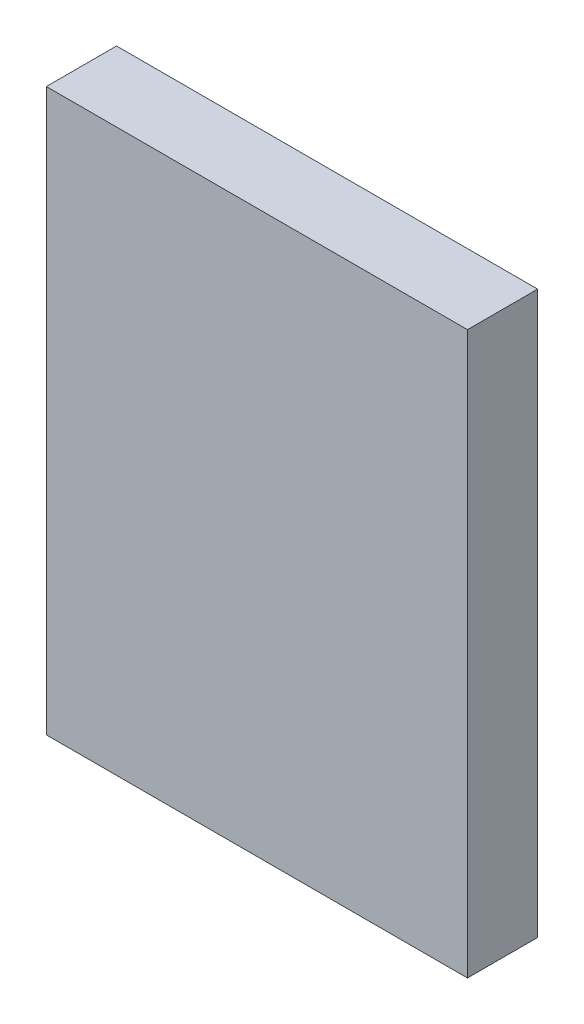
ISO-10303-21;
HEADER;
FILE_DESCRIPTION(('STEP AP214'),'2;1');
FILE_NAME('part.step','',(''),(''),'','','');
FILE_SCHEMA(('AUTOMOTIVE_DESIGN { 1 0 10303 214 1 1 1 1 }'));
ENDSEC;
DATA;
#1=APPLICATION_CONTEXT('core data for automotive mechanical design processes');
#2=APPLICATION_PROTOCOL_DEFINITION('international standard','automotive_design',2000,#1);
#3=PRODUCT_CONTEXT('',#1,'mechanical');
#4=PRODUCT('Part','Part','',(#3));
#5=PRODUCT_RELATED_PRODUCT_CATEGORY('part','',(#4));
#6=PRODUCT_DEFINITION_FORMATION('','',#4);
#7=PRODUCT_DEFINITION_CONTEXT('part definition',#1,'design');
#8=PRODUCT_DEFINITION('design','',#6,#7);
#9=PRODUCT_DEFINITION_SHAPE('','',#8);
#10=(LENGTH_UNIT() NAMED_UNIT(*) SI_UNIT(.MILLI.,.METRE.));
#11=(NAMED_UNIT(*) PLANE_ANGLE_UNIT() SI_UNIT($,.RADIAN.));
#12=(NAMED_UNIT(*) SI_UNIT($,.STERADIAN.) SOLID_ANGLE_UNIT());
#13=UNCERTAINTY_MEASURE_WITH_UNIT(LENGTH_MEASURE(1.E-05),#10,'distance_accuracy_value','');
#14=(GEOMETRIC_REPRESENTATION_CONTEXT(3) GLOBAL_UNCERTAINTY_ASSIGNED_CONTEXT((#13)) GLOBAL_UNIT_ASSIGNED_CONTEXT((#10,
#11,#12)) REPRESENTATION_CONTEXT('',''));
#15=CARTESIAN_POINT('',(0.,0.,0.));
#16=DIRECTION('',(0.,0.,1.));
#17=DIRECTION('',(1.,0.,0.));
#18=AXIS2_PLACEMENT_3D('',#15,#16,#17);
#19=CARTESIAN_POINT('',(-54.4963067140429,28.2289691692874,3.175));
#20=DIRECTION('',(1.,0.,0.));
#21=DIRECTION('',(0.,0.,-1.));
#22=AXIS2_PLACEMENT_3D('',#19,#20,#21);
#23=PLANE('',#22);
#24=DIRECTION('',(0.,-1.,0.));
#25=VECTOR('',#24,1.);
#26=CARTESIAN_POINT('',(-54.4963067140429,28.2289691692874,0.));
#27=LINE('',#26,#25);
#28=CARTESIAN_POINT('',(-54.4963067140429,28.2289691692874,0.));
#29=VERTEX_POINT('',#28);
#30=CARTESIAN_POINT('',(-54.4963067140429,2.82896916928741,0.));
#31=VERTEX_POINT('',#30);
#32=EDGE_CURVE('E80',#29,#31,#27,.T.);
#33=ORIENTED_EDGE('',*,*,#32,.T.);
#34=DIRECTION('',(0.,0.,-1.));
#35=VECTOR('',#34,1.);
#36=CARTESIAN_POINT('',(-54.4963067140429,2.82896916928741,3.175));
#37=LINE('',#36,#35);
#38=CARTESIAN_POINT('',(-54.4963067140429,2.82896916928741,3.175));
#39=VERTEX_POINT('',#38);
#40=EDGE_CURVE('E11',#39,#31,#37,.T.);
#41=ORIENTED_EDGE('',*,*,#40,.F.);
#42=DIRECTION('',(0.,-1.,0.));
#43=VECTOR('',#42,1.);
#44=CARTESIAN_POINT('',(-54.4963067140429,28.2289691692874,3.175));
#45=LINE('',#44,#43);
#46=CARTESIAN_POINT('',(-54.4963067140429,28.2289691692874,3.175));
#47=VERTEX_POINT('',#46);
#48=EDGE_CURVE('E68',#47,#39,#45,.T.);
#49=ORIENTED_EDGE('',*,*,#48,.F.);
#50=DIRECTION('',(0.,0.,-1.));
#51=VECTOR('',#50,1.);
#52=CARTESIAN_POINT('',(-54.4963067140429,28.2289691692874,3.175));
#53=LINE('',#52,#51);
#54=EDGE_CURVE('E76',#47,#29,#53,.T.);
#55=ORIENTED_EDGE('',*,*,#54,.T.);
#56=EDGE_LOOP('',(#33,#41,#49,#55));
#57=FACE_BOUND('',#56,.T.);
#58=ADVANCED_FACE('F17',(#57),#23,.F.);
#59=CARTESIAN_POINT('',(-54.4963067140429,2.82896916928741,3.175));
#60=DIRECTION('',(0.,1.,0.));
#61=DIRECTION('',(0.,0.,1.));
#62=AXIS2_PLACEMENT_3D('',#59,#60,#61);
#63=PLANE('',#62);
#64=DIRECTION('',(1.,0.,0.));
#65=VECTOR('',#64,1.);
#66=CARTESIAN_POINT('',(-54.4963067140429,2.82896916928741,0.));
#67=LINE('',#66,#65);
#68=CARTESIAN_POINT('',(-35.4463067140429,2.82896916928741,0.));
#69=VERTEX_POINT('',#68);
#70=EDGE_CURVE('E72',#31,#69,#67,.T.);
#71=ORIENTED_EDGE('',*,*,#70,.T.);
#72=DIRECTION('',(0.,0.,-1.));
#73=VECTOR('',#72,1.);
#74=CARTESIAN_POINT('',(-35.4463067140429,2.82896916928741,3.175));
#75=LINE('',#74,#73);
#76=CARTESIAN_POINT('',(-35.4463067140429,2.82896916928741,3.175));
#77=VERTEX_POINT('',#76);
#78=EDGE_CURVE('E25',#77,#69,#75,.T.);
#79=ORIENTED_EDGE('',*,*,#78,.F.);
#80=DIRECTION('',(1.,0.,0.));
#81=VECTOR('',#80,1.);
#82=CARTESIAN_POINT('',(-54.4963067140429,2.82896916928741,3.175));
#83=LINE('',#82,#81);
#84=EDGE_CURVE('E63',#39,#77,#83,.T.);
#85=ORIENTED_EDGE('',*,*,#84,.F.);
#86=ORIENTED_EDGE('',*,*,#40,.T.);
#87=EDGE_LOOP('',(#71,#79,#85,#86));
#88=FACE_BOUND('',#87,.T.);
#89=ADVANCED_FACE('F71',(#88),#63,.F.);
#90=CARTESIAN_POINT('',(-35.4463067140429,28.2289691692874,3.175));
#91=DIRECTION('',(-1.,0.,0.));
#92=DIRECTION('',(0.,0.,1.));
#93=AXIS2_PLACEMENT_3D('',#90,#91,#92);
#94=PLANE('',#93);
#95=DIRECTION('',(0.,1.,0.));
#96=VECTOR('',#95,1.);
#97=CARTESIAN_POINT('',(-35.4463067140429,28.2289691692874,0.));
#98=LINE('',#97,#96);
#99=CARTESIAN_POINT('',(-35.4463067140429,28.2289691692874,0.));
#100=VERTEX_POINT('',#99);
#101=EDGE_CURVE('E50',#69,#100,#98,.T.);
#102=ORIENTED_EDGE('',*,*,#101,.T.);
#103=DIRECTION('',(0.,0.,-1.));
#104=VECTOR('',#103,1.);
#105=CARTESIAN_POINT('',(-35.4463067140429,28.2289691692874,3.175));
#106=LINE('',#105,#104);
#107=CARTESIAN_POINT('',(-35.4463067140429,28.2289691692874,3.175));
#108=VERTEX_POINT('',#107);
#109=EDGE_CURVE('E73',#108,#100,#106,.T.);
#110=ORIENTED_EDGE('',*,*,#109,.F.);
#111=DIRECTION('',(0.,1.,0.));
#112=VECTOR('',#111,1.);
#113=CARTESIAN_POINT('',(-35.4463067140429,28.2289691692874,3.175));
#114=LINE('',#113,#112);
#115=EDGE_CURVE('E66',#77,#108,#114,.T.);
#116=ORIENTED_EDGE('',*,*,#115,.F.);
#117=ORIENTED_EDGE('',*,*,#78,.T.);
#118=EDGE_LOOP('',(#102,#110,#116,#117));
#119=FACE_BOUND('',#118,.T.);
#120=ADVANCED_FACE('F74',(#119),#94,.F.);
#121=CARTESIAN_POINT('',(-54.4963067140429,28.2289691692874,3.175));
#122=DIRECTION('',(0.,-1.,0.));
#123=DIRECTION('',(0.,0.,-1.));
#124=AXIS2_PLACEMENT_3D('',#121,#122,#123);
#125=PLANE('',#124);
#126=DIRECTION('',(-1.,0.,0.));
#127=VECTOR('',#126,1.);
#128=CARTESIAN_POINT('',(-54.4963067140429,28.2289691692874,0.));
#129=LINE('',#128,#127);
#130=EDGE_CURVE('E56',#100,#29,#129,.T.);
#131=ORIENTED_EDGE('',*,*,#130,.T.);
#132=ORIENTED_EDGE('',*,*,#54,.F.);
#133=DIRECTION('',(-1.,0.,0.));
#134=VECTOR('',#133,1.);
#135=CARTESIAN_POINT('',(-54.4963067140429,28.2289691692874,3.175));
#136=LINE('',#135,#134);
#137=EDGE_CURVE('E33',#108,#47,#136,.T.);
#138=ORIENTED_EDGE('',*,*,#137,.F.);
#139=ORIENTED_EDGE('',*,*,#109,.T.);
#140=EDGE_LOOP('',(#131,#132,#138,#139));
#141=FACE_BOUND('',#140,.T.);
#142=ADVANCED_FACE('F87',(#141),#125,.F.);
#143=CARTESIAN_POINT('',(-54.4963067140429,2.82896916928741,3.175));
#144=DIRECTION('',(0.,0.,1.));
#145=DIRECTION('',(1.,0.,0.));
#146=AXIS2_PLACEMENT_3D('',#143,#144,#145);
#147=PLANE('',#146);
#148=ORIENTED_EDGE('',*,*,#48,.T.);
#149=ORIENTED_EDGE('',*,*,#84,.T.);
#150=ORIENTED_EDGE('',*,*,#115,.T.);
#151=ORIENTED_EDGE('',*,*,#137,.T.);
#152=EDGE_LOOP('',(#148,#149,#150,#151));
#153=FACE_BOUND('',#152,.T.);
#154=ADVANCED_FACE('F64',(#153),#147,.T.);
#155=CARTESIAN_POINT('',(-54.4963067140429,2.82896916928741,0.));
#156=DIRECTION('',(0.,0.,1.));
#157=DIRECTION('',(1.,0.,0.));
#158=AXIS2_PLACEMENT_3D('',#155,#156,#157);
#159=PLANE('',#158);
#160=ORIENTED_EDGE('',*,*,#32,.F.);
#161=ORIENTED_EDGE('',*,*,#130,.F.);
#162=ORIENTED_EDGE('',*,*,#101,.F.);
#163=ORIENTED_EDGE('',*,*,#70,.F.);
#164=EDGE_LOOP('',(#160,#161,#162,#163));
#165=FACE_BOUND('',#164,.T.);
#166=ADVANCED_FACE('F90',(#165),#159,.F.);
#167=CLOSED_SHELL('',(#58,#89,#120,#142,#154,#166));
#168=MANIFOLD_SOLID_BREP('B1',#167);
#169=ADVANCED_BREP_SHAPE_REPRESENTATION('',(#18,#168),#14);
#170=SHAPE_DEFINITION_REPRESENTATION(#9,#169);
ENDSEC;
END-ISO-10303-21;
